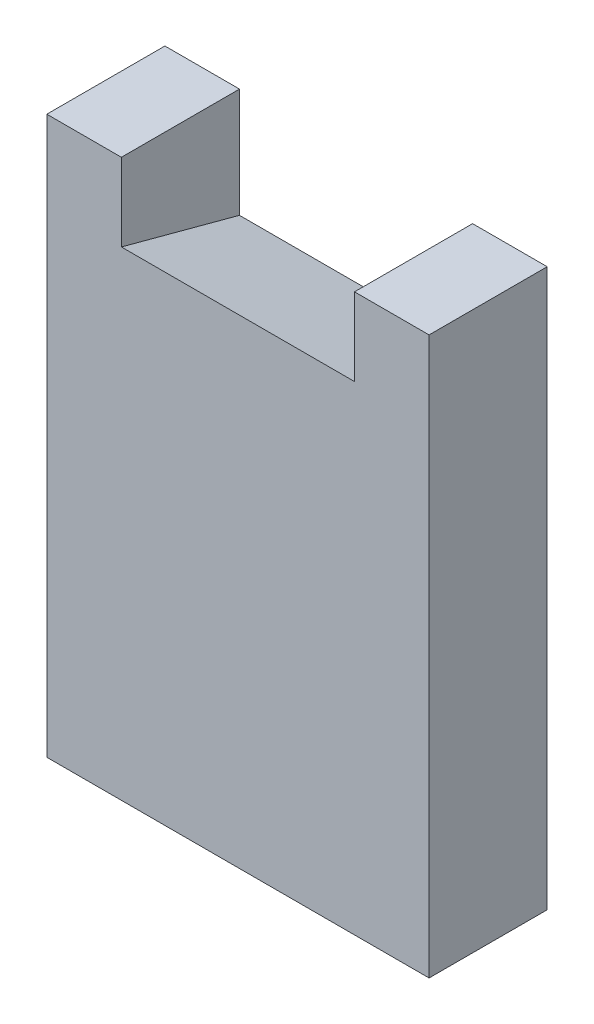
ISO-10303-21;
HEADER;
FILE_DESCRIPTION(('STEP AP214'),'2;1');
FILE_NAME('part.step','',(''),(''),'','','');
FILE_SCHEMA(('AUTOMOTIVE_DESIGN { 1 0 10303 214 1 1 1 1 }'));
ENDSEC;
DATA;
#1=APPLICATION_CONTEXT('core data for automotive mechanical design processes');
#2=APPLICATION_PROTOCOL_DEFINITION('international standard','automotive_design',2000,#1);
#3=PRODUCT_CONTEXT('',#1,'mechanical');
#4=PRODUCT('Part','Part','',(#3));
#5=PRODUCT_RELATED_PRODUCT_CATEGORY('part','',(#4));
#6=PRODUCT_DEFINITION_FORMATION('','',#4);
#7=PRODUCT_DEFINITION_CONTEXT('part definition',#1,'design');
#8=PRODUCT_DEFINITION('design','',#6,#7);
#9=PRODUCT_DEFINITION_SHAPE('','',#8);
#10=(LENGTH_UNIT() NAMED_UNIT(*) SI_UNIT(.MILLI.,.METRE.));
#11=(NAMED_UNIT(*) PLANE_ANGLE_UNIT() SI_UNIT($,.RADIAN.));
#12=(NAMED_UNIT(*) SI_UNIT($,.STERADIAN.) SOLID_ANGLE_UNIT());
#13=UNCERTAINTY_MEASURE_WITH_UNIT(LENGTH_MEASURE(1.E-05),#10,'distance_accuracy_value','');
#14=(GEOMETRIC_REPRESENTATION_CONTEXT(3) GLOBAL_UNCERTAINTY_ASSIGNED_CONTEXT((#13)) GLOBAL_UNIT_ASSIGNED_CONTEXT((#10,
#11,#12)) REPRESENTATION_CONTEXT('',''));
#15=CARTESIAN_POINT('',(0.,0.,0.));
#16=DIRECTION('',(0.,0.,1.));
#17=DIRECTION('',(1.,0.,0.));
#18=AXIS2_PLACEMENT_3D('',#15,#16,#17);
#19=CARTESIAN_POINT('',(0.,0.,7.6));
#20=DIRECTION('',(0.,1.,0.));
#21=DIRECTION('',(-1.,0.,0.));
#22=AXIS2_PLACEMENT_3D('',#19,#20,#21);
#23=PLANE('',#22);
#24=DIRECTION('',(1.,0.,0.));
#25=VECTOR('',#24,1.);
#26=CARTESIAN_POINT('',(0.,0.,0.));
#27=LINE('',#26,#25);
#28=CARTESIAN_POINT('',(19.8,0.,0.));
#29=VERTEX_POINT('',#28);
#30=CARTESIAN_POINT('',(24.6,0.,0.));
#31=VERTEX_POINT('',#30);
#32=EDGE_CURVE('E117',#29,#31,#27,.T.);
#33=ORIENTED_EDGE('',*,*,#32,.F.);
#34=DIRECTION('',(0.,0.,-1.));
#35=VECTOR('',#34,1.);
#36=CARTESIAN_POINT('',(19.8,0.,7.6));
#37=LINE('',#36,#35);
#38=CARTESIAN_POINT('',(19.8,0.,7.6));
#39=VERTEX_POINT('',#38);
#40=EDGE_CURVE('E11',#39,#29,#37,.T.);
#41=ORIENTED_EDGE('',*,*,#40,.F.);
#42=DIRECTION('',(1.,0.,0.));
#43=VECTOR('',#42,1.);
#44=CARTESIAN_POINT('',(0.,0.,7.6));
#45=LINE('',#44,#43);
#46=CARTESIAN_POINT('',(24.6,0.,7.6));
#47=VERTEX_POINT('',#46);
#48=EDGE_CURVE('E127',#39,#47,#45,.T.);
#49=ORIENTED_EDGE('',*,*,#48,.T.);
#50=DIRECTION('',(0.,0.,-1.));
#51=VECTOR('',#50,1.);
#52=CARTESIAN_POINT('',(24.6,0.,7.6));
#53=LINE('',#52,#51);
#54=EDGE_CURVE('E58',#47,#31,#53,.T.);
#55=ORIENTED_EDGE('',*,*,#54,.T.);
#56=EDGE_LOOP('',(#33,#41,#49,#55));
#57=FACE_BOUND('',#56,.T.);
#58=ADVANCED_FACE('F39',(#57),#23,.T.);
#59=CARTESIAN_POINT('',(19.8,0.,7.6));
#60=DIRECTION('',(1.,0.,0.));
#61=DIRECTION('',(0.,0.,-1.));
#62=AXIS2_PLACEMENT_3D('',#59,#60,#61);
#63=PLANE('',#62);
#64=DIRECTION('',(0.,-1.,0.));
#65=VECTOR('',#64,1.);
#66=CARTESIAN_POINT('',(19.8,0.,0.));
#67=LINE('',#66,#65);
#68=CARTESIAN_POINT('',(19.8,-7.03641386247654,0.));
#69=VERTEX_POINT('',#68);
#70=EDGE_CURVE('E107',#29,#69,#67,.T.);
#71=ORIENTED_EDGE('',*,*,#70,.T.);
#72=DIRECTION('',(0.,-0.258819045102521,-0.965925826289068));
#73=VECTOR('',#72,1.);
#74=CARTESIAN_POINT('',(19.8,-5.,7.6));
#75=LINE('',#74,#73);
#76=CARTESIAN_POINT('',(19.8,-5.,7.6));
#77=VERTEX_POINT('',#76);
#78=EDGE_CURVE('E49',#77,#69,#75,.T.);
#79=ORIENTED_EDGE('',*,*,#78,.F.);
#80=DIRECTION('',(0.,-1.,0.));
#81=VECTOR('',#80,1.);
#82=CARTESIAN_POINT('',(19.8,0.,7.6));
#83=LINE('',#82,#81);
#84=EDGE_CURVE('E155',#39,#77,#83,.T.);
#85=ORIENTED_EDGE('',*,*,#84,.F.);
#86=ORIENTED_EDGE('',*,*,#40,.T.);
#87=EDGE_LOOP('',(#71,#79,#85,#86));
#88=FACE_BOUND('',#87,.T.);
#89=ADVANCED_FACE('F164',(#88),#63,.F.);
#90=CARTESIAN_POINT('',(0.,-5.,7.6));
#91=DIRECTION('',(0.,0.965925826289068,-0.258819045102521));
#92=DIRECTION('',(0.,0.258819045102521,0.965925826289068));
#93=AXIS2_PLACEMENT_3D('',#90,#91,#92);
#94=PLANE('',#93);
#95=DIRECTION('',(1.,0.,0.));
#96=VECTOR('',#95,1.);
#97=CARTESIAN_POINT('',(0.,-7.03641386247654,0.));
#98=LINE('',#97,#96);
#99=CARTESIAN_POINT('',(4.8,-7.03641386247654,0.));
#100=VERTEX_POINT('',#99);
#101=EDGE_CURVE('E104',#100,#69,#98,.T.);
#102=ORIENTED_EDGE('',*,*,#101,.F.);
#103=DIRECTION('',(0.,-0.258819045102521,-0.965925826289068));
#104=VECTOR('',#103,1.);
#105=CARTESIAN_POINT('',(4.8,-5.,7.6));
#106=LINE('',#105,#104);
#107=CARTESIAN_POINT('',(4.8,-5.,7.6));
#108=VERTEX_POINT('',#107);
#109=EDGE_CURVE('E43',#108,#100,#106,.T.);
#110=ORIENTED_EDGE('',*,*,#109,.F.);
#111=DIRECTION('',(1.,0.,0.));
#112=VECTOR('',#111,1.);
#113=CARTESIAN_POINT('',(0.,-5.,7.6));
#114=LINE('',#113,#112);
#115=EDGE_CURVE('E151',#108,#77,#114,.T.);
#116=ORIENTED_EDGE('',*,*,#115,.T.);
#117=ORIENTED_EDGE('',*,*,#78,.T.);
#118=EDGE_LOOP('',(#102,#110,#116,#117));
#119=FACE_BOUND('',#118,.T.);
#120=ADVANCED_FACE('F41',(#119),#94,.T.);
#121=CARTESIAN_POINT('',(4.8,0.,7.6));
#122=DIRECTION('',(1.,0.,0.));
#123=DIRECTION('',(0.,1.,0.));
#124=AXIS2_PLACEMENT_3D('',#121,#122,#123);
#125=PLANE('',#124);
#126=DIRECTION('',(0.,-1.,0.));
#127=VECTOR('',#126,1.);
#128=CARTESIAN_POINT('',(4.8,0.,0.));
#129=LINE('',#128,#127);
#130=CARTESIAN_POINT('',(4.8,0.,0.));
#131=VERTEX_POINT('',#130);
#132=EDGE_CURVE('E96',#131,#100,#129,.T.);
#133=ORIENTED_EDGE('',*,*,#132,.F.);
#134=DIRECTION('',(0.,0.,-1.));
#135=VECTOR('',#134,1.);
#136=CARTESIAN_POINT('',(4.8,0.,7.6));
#137=LINE('',#136,#135);
#138=CARTESIAN_POINT('',(4.8,0.,7.6));
#139=VERTEX_POINT('',#138);
#140=EDGE_CURVE('E102',#139,#131,#137,.T.);
#141=ORIENTED_EDGE('',*,*,#140,.F.);
#142=DIRECTION('',(0.,-1.,0.));
#143=VECTOR('',#142,1.);
#144=CARTESIAN_POINT('',(4.8,0.,7.6));
#145=LINE('',#144,#143);
#146=EDGE_CURVE('E100',#139,#108,#145,.T.);
#147=ORIENTED_EDGE('',*,*,#146,.T.);
#148=ORIENTED_EDGE('',*,*,#109,.T.);
#149=EDGE_LOOP('',(#133,#141,#147,#148));
#150=FACE_BOUND('',#149,.T.);
#151=ADVANCED_FACE('F93',(#150),#125,.T.);
#152=CARTESIAN_POINT('',(0.,0.,0.));
#153=VERTEX_POINT('',#152);
#154=EDGE_CURVE('E113',#153,#131,#27,.T.);
#155=ORIENTED_EDGE('',*,*,#154,.F.);
#156=DIRECTION('',(0.,0.,-1.));
#157=VECTOR('',#156,1.);
#158=CARTESIAN_POINT('',(0.,0.,7.6));
#159=LINE('',#158,#157);
#160=CARTESIAN_POINT('',(0.,0.,7.6));
#161=VERTEX_POINT('',#160);
#162=EDGE_CURVE('E135',#161,#153,#159,.T.);
#163=ORIENTED_EDGE('',*,*,#162,.F.);
#164=EDGE_CURVE('E143',#161,#139,#45,.T.);
#165=ORIENTED_EDGE('',*,*,#164,.T.);
#166=ORIENTED_EDGE('',*,*,#140,.T.);
#167=EDGE_LOOP('',(#155,#163,#165,#166));
#168=FACE_BOUND('',#167,.T.);
#169=ADVANCED_FACE('F139',(#168),#23,.T.);
#170=CARTESIAN_POINT('',(0.,0.,7.6));
#171=DIRECTION('',(1.,0.,0.));
#172=DIRECTION('',(0.,1.,0.));
#173=AXIS2_PLACEMENT_3D('',#170,#171,#172);
#174=PLANE('',#173);
#175=DIRECTION('',(0.,-1.,0.));
#176=VECTOR('',#175,1.);
#177=CARTESIAN_POINT('',(0.,0.,0.));
#178=LINE('',#177,#176);
#179=CARTESIAN_POINT('',(0.,-35.84,0.));
#180=VERTEX_POINT('',#179);
#181=EDGE_CURVE('E115',#153,#180,#178,.T.);
#182=ORIENTED_EDGE('',*,*,#181,.T.);
#183=DIRECTION('',(0.,0.,-1.));
#184=VECTOR('',#183,1.);
#185=CARTESIAN_POINT('',(0.,-35.84,7.6));
#186=LINE('',#185,#184);
#187=CARTESIAN_POINT('',(0.,-35.84,7.6));
#188=VERTEX_POINT('',#187);
#189=EDGE_CURVE('E132',#188,#180,#186,.T.);
#190=ORIENTED_EDGE('',*,*,#189,.F.);
#191=DIRECTION('',(0.,-1.,0.));
#192=VECTOR('',#191,1.);
#193=CARTESIAN_POINT('',(0.,0.,7.6));
#194=LINE('',#193,#192);
#195=EDGE_CURVE('E153',#161,#188,#194,.T.);
#196=ORIENTED_EDGE('',*,*,#195,.F.);
#197=ORIENTED_EDGE('',*,*,#162,.T.);
#198=EDGE_LOOP('',(#182,#190,#196,#197));
#199=FACE_BOUND('',#198,.T.);
#200=ADVANCED_FACE('F178',(#199),#174,.F.);
#201=CARTESIAN_POINT('',(0.,-35.84,7.6));
#202=DIRECTION('',(0.,1.,0.));
#203=DIRECTION('',(-1.,0.,0.));
#204=AXIS2_PLACEMENT_3D('',#201,#202,#203);
#205=PLANE('',#204);
#206=DIRECTION('',(1.,0.,0.));
#207=VECTOR('',#206,1.);
#208=CARTESIAN_POINT('',(0.,-35.84,0.));
#209=LINE('',#208,#207);
#210=CARTESIAN_POINT('',(24.6,-35.84,0.));
#211=VERTEX_POINT('',#210);
#212=EDGE_CURVE('E121',#180,#211,#209,.T.);
#213=ORIENTED_EDGE('',*,*,#212,.T.);
#214=DIRECTION('',(0.,0.,-1.));
#215=VECTOR('',#214,1.);
#216=CARTESIAN_POINT('',(24.6,-35.84,7.6));
#217=LINE('',#216,#215);
#218=CARTESIAN_POINT('',(24.6,-35.84,7.6));
#219=VERTEX_POINT('',#218);
#220=EDGE_CURVE('E129',#219,#211,#217,.T.);
#221=ORIENTED_EDGE('',*,*,#220,.F.);
#222=DIRECTION('',(1.,0.,0.));
#223=VECTOR('',#222,1.);
#224=CARTESIAN_POINT('',(0.,-35.84,7.6));
#225=LINE('',#224,#223);
#226=EDGE_CURVE('E160',#188,#219,#225,.T.);
#227=ORIENTED_EDGE('',*,*,#226,.F.);
#228=ORIENTED_EDGE('',*,*,#189,.T.);
#229=EDGE_LOOP('',(#213,#221,#227,#228));
#230=FACE_BOUND('',#229,.T.);
#231=ADVANCED_FACE('F175',(#230),#205,.F.);
#232=CARTESIAN_POINT('',(24.6,0.,7.6));
#233=DIRECTION('',(1.,0.,0.));
#234=DIRECTION('',(0.,1.,0.));
#235=AXIS2_PLACEMENT_3D('',#232,#233,#234);
#236=PLANE('',#235);
#237=DIRECTION('',(0.,-1.,0.));
#238=VECTOR('',#237,1.);
#239=CARTESIAN_POINT('',(24.6,0.,0.));
#240=LINE('',#239,#238);
#241=EDGE_CURVE('E124',#31,#211,#240,.T.);
#242=ORIENTED_EDGE('',*,*,#241,.F.);
#243=ORIENTED_EDGE('',*,*,#54,.F.);
#244=DIRECTION('',(0.,-1.,0.));
#245=VECTOR('',#244,1.);
#246=CARTESIAN_POINT('',(24.6,0.,7.6));
#247=LINE('',#246,#245);
#248=EDGE_CURVE('E130',#47,#219,#247,.T.);
#249=ORIENTED_EDGE('',*,*,#248,.T.);
#250=ORIENTED_EDGE('',*,*,#220,.T.);
#251=EDGE_LOOP('',(#242,#243,#249,#250));
#252=FACE_BOUND('',#251,.T.);
#253=ADVANCED_FACE('F172',(#252),#236,.T.);
#254=CARTESIAN_POINT('',(0.,0.,7.6));
#255=DIRECTION('',(0.,0.,1.));
#256=DIRECTION('',(1.,0.,0.));
#257=AXIS2_PLACEMENT_3D('',#254,#255,#256);
#258=PLANE('',#257);
#259=ORIENTED_EDGE('',*,*,#48,.F.);
#260=ORIENTED_EDGE('',*,*,#84,.T.);
#261=ORIENTED_EDGE('',*,*,#115,.F.);
#262=ORIENTED_EDGE('',*,*,#146,.F.);
#263=ORIENTED_EDGE('',*,*,#164,.F.);
#264=ORIENTED_EDGE('',*,*,#195,.T.);
#265=ORIENTED_EDGE('',*,*,#226,.T.);
#266=ORIENTED_EDGE('',*,*,#248,.F.);
#267=EDGE_LOOP('',(#259,#260,#261,#262,#263,#264,#265,#266));
#268=FACE_BOUND('',#267,.T.);
#269=ADVANCED_FACE('F148',(#268),#258,.T.);
#270=CARTESIAN_POINT('',(0.,0.,0.));
#271=DIRECTION('',(0.,0.,1.));
#272=DIRECTION('',(1.,0.,0.));
#273=AXIS2_PLACEMENT_3D('',#270,#271,#272);
#274=PLANE('',#273);
#275=ORIENTED_EDGE('',*,*,#32,.T.);
#276=ORIENTED_EDGE('',*,*,#241,.T.);
#277=ORIENTED_EDGE('',*,*,#212,.F.);
#278=ORIENTED_EDGE('',*,*,#181,.F.);
#279=ORIENTED_EDGE('',*,*,#154,.T.);
#280=ORIENTED_EDGE('',*,*,#132,.T.);
#281=ORIENTED_EDGE('',*,*,#101,.T.);
#282=ORIENTED_EDGE('',*,*,#70,.F.);
#283=EDGE_LOOP('',(#275,#276,#277,#278,#279,#280,#281,#282));
#284=FACE_BOUND('',#283,.T.);
#285=ADVANCED_FACE('F110',(#284),#274,.F.);
#286=CLOSED_SHELL('',(#58,#89,#120,#151,#169,#200,#231,#253,#269,#285));
#287=MANIFOLD_SOLID_BREP('B2',#286);
#288=ADVANCED_BREP_SHAPE_REPRESENTATION('',(#18,#287),#14);
#289=SHAPE_DEFINITION_REPRESENTATION(#9,#288);
ENDSEC;
END-ISO-10303-21;
